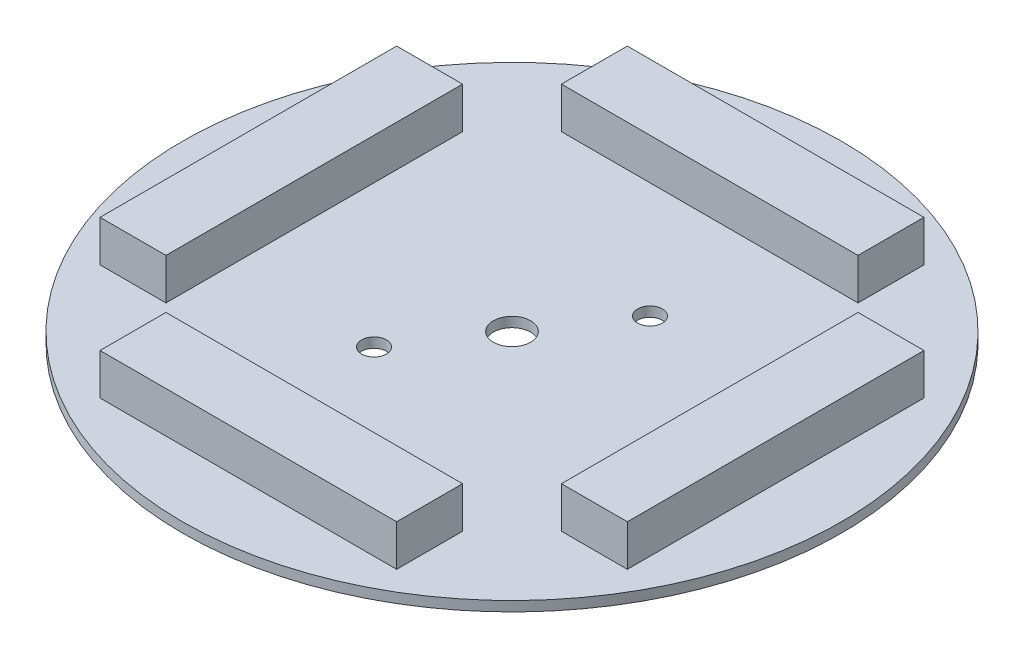
ISO-10303-21;
HEADER;
FILE_DESCRIPTION(('STEP AP214'),'2;1');
FILE_NAME('part.step','',(''),(''),'','','');
FILE_SCHEMA(('AUTOMOTIVE_DESIGN { 1 0 10303 214 1 1 1 1 }'));
ENDSEC;
DATA;
#1=APPLICATION_CONTEXT('core data for automotive mechanical design processes');
#2=APPLICATION_PROTOCOL_DEFINITION('international standard','automotive_design',2000,#1);
#3=PRODUCT_CONTEXT('',#1,'mechanical');
#4=PRODUCT('Part','Part','',(#3));
#5=PRODUCT_RELATED_PRODUCT_CATEGORY('part','',(#4));
#6=PRODUCT_DEFINITION_FORMATION('','',#4);
#7=PRODUCT_DEFINITION_CONTEXT('part definition',#1,'design');
#8=PRODUCT_DEFINITION('design','',#6,#7);
#9=PRODUCT_DEFINITION_SHAPE('','',#8);
#10=(LENGTH_UNIT() NAMED_UNIT(*) SI_UNIT(.MILLI.,.METRE.));
#11=(NAMED_UNIT(*) PLANE_ANGLE_UNIT() SI_UNIT($,.RADIAN.));
#12=(NAMED_UNIT(*) SI_UNIT($,.STERADIAN.) SOLID_ANGLE_UNIT());
#13=UNCERTAINTY_MEASURE_WITH_UNIT(LENGTH_MEASURE(1.E-05),#10,'distance_accuracy_value','');
#14=(GEOMETRIC_REPRESENTATION_CONTEXT(3) GLOBAL_UNCERTAINTY_ASSIGNED_CONTEXT((#13)) GLOBAL_UNIT_ASSIGNED_CONTEXT((#10,
#11,#12)) REPRESENTATION_CONTEXT('',''));
#15=CARTESIAN_POINT('',(0.,0.,0.));
#16=DIRECTION('',(0.,0.,1.));
#17=DIRECTION('',(1.,0.,0.));
#18=AXIS2_PLACEMENT_3D('',#15,#16,#17);
#19=CARTESIAN_POINT('',(0.,0.6,0.));
#20=DIRECTION('',(0.,1.,0.));
#21=DIRECTION('',(0.,0.,1.));
#22=AXIS2_PLACEMENT_3D('',#19,#20,#21);
#23=PLANE('',#22);
#24=CARTESIAN_POINT('',(0.,0.6,0.));
#25=DIRECTION('',(0.,1.,0.));
#26=DIRECTION('',(0.,0.,1.));
#27=AXIS2_PLACEMENT_3D('',#24,#25,#26);
#28=CIRCLE('',#27,1.1303);
#29=CARTESIAN_POINT('',(0.,0.6,1.1303));
#30=VERTEX_POINT('',#29);
#31=EDGE_CURVE('E299',#30,#30,#28,.T.);
#32=ORIENTED_EDGE('',*,*,#31,.F.);
#33=EDGE_LOOP('',(#32));
#34=FACE_BOUND('',#33,.T.);
#35=CARTESIAN_POINT('',(0.,0.6,0.));
#36=DIRECTION('',(0.,1.,0.));
#37=DIRECTION('',(0.,0.,1.));
#38=AXIS2_PLACEMENT_3D('',#35,#36,#37);
#39=CIRCLE('',#38,20.);
#40=CARTESIAN_POINT('',(0.,0.6,20.));
#41=VERTEX_POINT('',#40);
#42=EDGE_CURVE('E12',#41,#41,#39,.T.);
#43=ORIENTED_EDGE('',*,*,#42,.T.);
#44=EDGE_LOOP('',(#43));
#45=FACE_BOUND('',#44,.T.);
#46=CARTESIAN_POINT('',(-3.37254258421209,0.6,5.));
#47=DIRECTION('',(0.,1.,0.));
#48=DIRECTION('',(0.,0.,1.));
#49=AXIS2_PLACEMENT_3D('',#46,#47,#48);
#50=CIRCLE('',#49,0.75);
#51=CARTESIAN_POINT('',(-3.37254258421209,0.6,5.75));
#52=VERTEX_POINT('',#51);
#53=EDGE_CURVE('E305',#52,#52,#50,.T.);
#54=ORIENTED_EDGE('',*,*,#53,.F.);
#55=EDGE_LOOP('',(#54));
#56=FACE_BOUND('',#55,.T.);
#57=CARTESIAN_POINT('',(3.37254258421208,0.6,-5.));
#58=DIRECTION('',(0.,1.,0.));
#59=DIRECTION('',(0.,0.,1.));
#60=AXIS2_PLACEMENT_3D('',#57,#58,#59);
#61=CIRCLE('',#60,0.75);
#62=CARTESIAN_POINT('',(3.37254258421208,0.6,-4.25));
#63=VERTEX_POINT('',#62);
#64=EDGE_CURVE('E293',#63,#63,#61,.T.);
#65=ORIENTED_EDGE('',*,*,#64,.F.);
#66=EDGE_LOOP('',(#65));
#67=FACE_BOUND('',#66,.T.);
#68=DIRECTION('',(1.,0.,0.));
#69=VECTOR('',#68,1.);
#70=CARTESIAN_POINT('',(-9.,0.6,-12.));
#71=LINE('',#70,#69);
#72=CARTESIAN_POINT('',(-9.,0.6,-12.));
#73=VERTEX_POINT('',#72);
#74=CARTESIAN_POINT('',(9.,0.6,-12.));
#75=VERTEX_POINT('',#74);
#76=EDGE_CURVE('E275',#73,#75,#71,.T.);
#77=ORIENTED_EDGE('',*,*,#76,.F.);
#78=DIRECTION('',(0.,0.,1.));
#79=VECTOR('',#78,1.);
#80=CARTESIAN_POINT('',(-9.,0.6,-16.));
#81=LINE('',#80,#79);
#82=CARTESIAN_POINT('',(-9.,0.6,-16.));
#83=VERTEX_POINT('',#82);
#84=EDGE_CURVE('E259',#83,#73,#81,.T.);
#85=ORIENTED_EDGE('',*,*,#84,.F.);
#86=DIRECTION('',(1.,0.,0.));
#87=VECTOR('',#86,1.);
#88=CARTESIAN_POINT('',(-9.,0.6,-16.));
#89=LINE('',#88,#87);
#90=CARTESIAN_POINT('',(9.,0.6,-16.));
#91=VERTEX_POINT('',#90);
#92=EDGE_CURVE('E264',#83,#91,#89,.T.);
#93=ORIENTED_EDGE('',*,*,#92,.T.);
#94=DIRECTION('',(0.,0.,1.));
#95=VECTOR('',#94,1.);
#96=CARTESIAN_POINT('',(9.,0.6,-16.));
#97=LINE('',#96,#95);
#98=EDGE_CURVE('E278',#91,#75,#97,.T.);
#99=ORIENTED_EDGE('',*,*,#98,.T.);
#100=EDGE_LOOP('',(#77,#85,#93,#99));
#101=FACE_BOUND('',#100,.T.);
#102=DIRECTION('',(0.,0.,-1.));
#103=VECTOR('',#102,1.);
#104=CARTESIAN_POINT('',(-12.,0.6,9.00000000000004));
#105=LINE('',#104,#103);
#106=CARTESIAN_POINT('',(-12.,0.6,9.00000000000004));
#107=VERTEX_POINT('',#106);
#108=CARTESIAN_POINT('',(-12.,0.6,-8.99999999999996));
#109=VERTEX_POINT('',#108);
#110=EDGE_CURVE('E242',#107,#109,#105,.T.);
#111=ORIENTED_EDGE('',*,*,#110,.F.);
#112=DIRECTION('',(1.,0.,0.));
#113=VECTOR('',#112,1.);
#114=CARTESIAN_POINT('',(-16.,0.6,9.00000000000006));
#115=LINE('',#114,#113);
#116=CARTESIAN_POINT('',(-16.,0.6,9.00000000000006));
#117=VERTEX_POINT('',#116);
#118=EDGE_CURVE('E226',#117,#107,#115,.T.);
#119=ORIENTED_EDGE('',*,*,#118,.F.);
#120=DIRECTION('',(0.,0.,-1.));
#121=VECTOR('',#120,1.);
#122=CARTESIAN_POINT('',(-16.,0.6,9.00000000000006));
#123=LINE('',#122,#121);
#124=CARTESIAN_POINT('',(-16.,0.6,-8.99999999999994));
#125=VERTEX_POINT('',#124);
#126=EDGE_CURVE('E231',#117,#125,#123,.T.);
#127=ORIENTED_EDGE('',*,*,#126,.T.);
#128=DIRECTION('',(1.,0.,0.));
#129=VECTOR('',#128,1.);
#130=CARTESIAN_POINT('',(-16.,0.6,-8.99999999999994));
#131=LINE('',#130,#129);
#132=EDGE_CURVE('E245',#125,#109,#131,.T.);
#133=ORIENTED_EDGE('',*,*,#132,.T.);
#134=EDGE_LOOP('',(#111,#119,#127,#133));
#135=FACE_BOUND('',#134,.T.);
#136=DIRECTION('',(-1.,0.,0.));
#137=VECTOR('',#136,1.);
#138=CARTESIAN_POINT('',(9.,0.6,12.));
#139=LINE('',#138,#137);
#140=CARTESIAN_POINT('',(9.,0.6,12.));
#141=VERTEX_POINT('',#140);
#142=CARTESIAN_POINT('',(-9.,0.6,12.));
#143=VERTEX_POINT('',#142);
#144=EDGE_CURVE('E191',#141,#143,#139,.T.);
#145=ORIENTED_EDGE('',*,*,#144,.F.);
#146=DIRECTION('',(0.,0.,-1.));
#147=VECTOR('',#146,1.);
#148=CARTESIAN_POINT('',(9.,0.6,16.));
#149=LINE('',#148,#147);
#150=CARTESIAN_POINT('',(9.,0.6,16.));
#151=VERTEX_POINT('',#150);
#152=EDGE_CURVE('E188',#151,#141,#149,.T.);
#153=ORIENTED_EDGE('',*,*,#152,.F.);
#154=DIRECTION('',(-1.,0.,0.));
#155=VECTOR('',#154,1.);
#156=CARTESIAN_POINT('',(9.,0.6,16.));
#157=LINE('',#156,#155);
#158=CARTESIAN_POINT('',(-9.,0.6,16.));
#159=VERTEX_POINT('',#158);
#160=EDGE_CURVE('E201',#151,#159,#157,.T.);
#161=ORIENTED_EDGE('',*,*,#160,.T.);
#162=DIRECTION('',(0.,0.,-1.));
#163=VECTOR('',#162,1.);
#164=CARTESIAN_POINT('',(-9.,0.6,16.));
#165=LINE('',#164,#163);
#166=EDGE_CURVE('E212',#159,#143,#165,.T.);
#167=ORIENTED_EDGE('',*,*,#166,.T.);
#168=EDGE_LOOP('',(#145,#153,#161,#167));
#169=FACE_BOUND('',#168,.T.);
#170=DIRECTION('',(0.,0.,1.));
#171=VECTOR('',#170,1.);
#172=CARTESIAN_POINT('',(11.9999999999999,0.6,-9.00000000000012));
#173=LINE('',#172,#171);
#174=CARTESIAN_POINT('',(11.9999999999999,0.6,-9.00000000000012));
#175=VERTEX_POINT('',#174);
#176=CARTESIAN_POINT('',(12.0000000000001,0.6,8.99999999999988));
#177=VERTEX_POINT('',#176);
#178=EDGE_CURVE('E68',#175,#177,#173,.T.);
#179=ORIENTED_EDGE('',*,*,#178,.F.);
#180=DIRECTION('',(-1.,0.,0.));
#181=VECTOR('',#180,1.);
#182=CARTESIAN_POINT('',(15.9999999999999,0.6,-9.00000000000017));
#183=LINE('',#182,#181);
#184=CARTESIAN_POINT('',(15.9999999999999,0.6,-9.00000000000017));
#185=VERTEX_POINT('',#184);
#186=EDGE_CURVE('E187',#185,#175,#183,.T.);
#187=ORIENTED_EDGE('',*,*,#186,.F.);
#188=DIRECTION('',(0.,0.,1.));
#189=VECTOR('',#188,1.);
#190=CARTESIAN_POINT('',(15.9999999999999,0.6,-9.00000000000017));
#191=LINE('',#190,#189);
#192=CARTESIAN_POINT('',(16.0000000000001,0.6,8.99999999999983));
#193=VERTEX_POINT('',#192);
#194=EDGE_CURVE('E184',#185,#193,#191,.T.);
#195=ORIENTED_EDGE('',*,*,#194,.T.);
#196=DIRECTION('',(-1.,0.,0.));
#197=VECTOR('',#196,1.);
#198=CARTESIAN_POINT('',(16.0000000000001,0.6,8.99999999999983));
#199=LINE('',#198,#197);
#200=EDGE_CURVE('E73',#193,#177,#199,.T.);
#201=ORIENTED_EDGE('',*,*,#200,.T.);
#202=EDGE_LOOP('',(#179,#187,#195,#201));
#203=FACE_BOUND('',#202,.T.);
#204=ADVANCED_FACE('F53',(#34,#45,#56,#67,#101,#135,#169,#203),#23,.T.);
#205=CARTESIAN_POINT('',(0.,0.,0.));
#206=DIRECTION('',(0.,1.,0.));
#207=DIRECTION('',(0.,0.,1.));
#208=AXIS2_PLACEMENT_3D('',#205,#206,#207);
#209=PLANE('',#208);
#210=CARTESIAN_POINT('',(0.,0.,0.));
#211=DIRECTION('',(0.,1.,0.));
#212=DIRECTION('',(0.,0.,1.));
#213=AXIS2_PLACEMENT_3D('',#210,#211,#212);
#214=CIRCLE('',#213,20.);
#215=CARTESIAN_POINT('',(0.,0.,20.));
#216=VERTEX_POINT('',#215);
#217=EDGE_CURVE('E57',#216,#216,#214,.T.);
#218=ORIENTED_EDGE('',*,*,#217,.F.);
#219=EDGE_LOOP('',(#218));
#220=FACE_BOUND('',#219,.T.);
#221=CARTESIAN_POINT('',(-3.37254258421209,0.,5.));
#222=DIRECTION('',(0.,1.,0.));
#223=DIRECTION('',(0.,0.,1.));
#224=AXIS2_PLACEMENT_3D('',#221,#222,#223);
#225=CIRCLE('',#224,0.75);
#226=CARTESIAN_POINT('',(-3.37254258421209,0.,5.75));
#227=VERTEX_POINT('',#226);
#228=EDGE_CURVE('E302',#227,#227,#225,.T.);
#229=ORIENTED_EDGE('',*,*,#228,.T.);
#230=EDGE_LOOP('',(#229));
#231=FACE_BOUND('',#230,.T.);
#232=CARTESIAN_POINT('',(0.,0.,0.));
#233=DIRECTION('',(0.,1.,0.));
#234=DIRECTION('',(0.,0.,1.));
#235=AXIS2_PLACEMENT_3D('',#232,#233,#234);
#236=CIRCLE('',#235,1.1303);
#237=CARTESIAN_POINT('',(0.,0.,1.1303));
#238=VERTEX_POINT('',#237);
#239=EDGE_CURVE('E296',#238,#238,#236,.T.);
#240=ORIENTED_EDGE('',*,*,#239,.T.);
#241=EDGE_LOOP('',(#240));
#242=FACE_BOUND('',#241,.T.);
#243=CARTESIAN_POINT('',(3.37254258421208,0.,-5.));
#244=DIRECTION('',(0.,1.,0.));
#245=DIRECTION('',(0.,0.,1.));
#246=AXIS2_PLACEMENT_3D('',#243,#244,#245);
#247=CIRCLE('',#246,0.75);
#248=CARTESIAN_POINT('',(3.37254258421208,0.,-4.25));
#249=VERTEX_POINT('',#248);
#250=EDGE_CURVE('E292',#249,#249,#247,.T.);
#251=ORIENTED_EDGE('',*,*,#250,.T.);
#252=EDGE_LOOP('',(#251));
#253=FACE_BOUND('',#252,.T.);
#254=ADVANCED_FACE('F311',(#220,#231,#242,#253),#209,.F.);
#255=CARTESIAN_POINT('',(0.,0.6,0.));
#256=DIRECTION('',(0.,-1.,0.));
#257=DIRECTION('',(0.,0.,-1.));
#258=AXIS2_PLACEMENT_3D('',#255,#256,#257);
#259=CYLINDRICAL_SURFACE('',#258,20.);
#260=ORIENTED_EDGE('',*,*,#42,.F.);
#261=EDGE_LOOP('',(#260));
#262=FACE_BOUND('',#261,.T.);
#263=ORIENTED_EDGE('',*,*,#217,.T.);
#264=EDGE_LOOP('',(#263));
#265=FACE_BOUND('',#264,.T.);
#266=ADVANCED_FACE('F55',(#262,#265),#259,.T.);
#267=CARTESIAN_POINT('',(-3.37254258421209,0.6,5.));
#268=DIRECTION('',(0.,-1.,0.));
#269=DIRECTION('',(0.,0.,-1.));
#270=AXIS2_PLACEMENT_3D('',#267,#268,#269);
#271=CYLINDRICAL_SURFACE('',#270,0.75);
#272=ORIENTED_EDGE('',*,*,#53,.T.);
#273=EDGE_LOOP('',(#272));
#274=FACE_BOUND('',#273,.T.);
#275=ORIENTED_EDGE('',*,*,#228,.F.);
#276=EDGE_LOOP('',(#275));
#277=FACE_BOUND('',#276,.T.);
#278=ADVANCED_FACE('F314',(#274,#277),#271,.F.);
#279=CARTESIAN_POINT('',(0.,0.6,0.));
#280=DIRECTION('',(0.,-1.,0.));
#281=DIRECTION('',(0.,0.,-1.));
#282=AXIS2_PLACEMENT_3D('',#279,#280,#281);
#283=CYLINDRICAL_SURFACE('',#282,1.1303);
#284=ORIENTED_EDGE('',*,*,#31,.T.);
#285=EDGE_LOOP('',(#284));
#286=FACE_BOUND('',#285,.T.);
#287=ORIENTED_EDGE('',*,*,#239,.F.);
#288=EDGE_LOOP('',(#287));
#289=FACE_BOUND('',#288,.T.);
#290=ADVANCED_FACE('F316',(#286,#289),#283,.F.);
#291=CARTESIAN_POINT('',(3.37254258421208,0.6,-5.));
#292=DIRECTION('',(0.,-1.,0.));
#293=DIRECTION('',(0.,0.,-1.));
#294=AXIS2_PLACEMENT_3D('',#291,#292,#293);
#295=CYLINDRICAL_SURFACE('',#294,0.75);
#296=ORIENTED_EDGE('',*,*,#64,.T.);
#297=EDGE_LOOP('',(#296));
#298=FACE_BOUND('',#297,.T.);
#299=ORIENTED_EDGE('',*,*,#250,.F.);
#300=EDGE_LOOP('',(#299));
#301=FACE_BOUND('',#300,.T.);
#302=ADVANCED_FACE('F323',(#298,#301),#295,.F.);
#303=CARTESIAN_POINT('',(-9.,3.1,-16.));
#304=DIRECTION('',(1.,0.,0.));
#305=DIRECTION('',(0.,0.,-1.));
#306=AXIS2_PLACEMENT_3D('',#303,#304,#305);
#307=PLANE('',#306);
#308=ORIENTED_EDGE('',*,*,#84,.T.);
#309=DIRECTION('',(0.,-1.,0.));
#310=VECTOR('',#309,1.);
#311=CARTESIAN_POINT('',(-9.,3.1,-12.));
#312=LINE('',#311,#310);
#313=CARTESIAN_POINT('',(-9.,3.1,-12.));
#314=VERTEX_POINT('',#313);
#315=EDGE_CURVE('E289',#314,#73,#312,.T.);
#316=ORIENTED_EDGE('',*,*,#315,.F.);
#317=DIRECTION('',(0.,0.,1.));
#318=VECTOR('',#317,1.);
#319=CARTESIAN_POINT('',(-9.,3.1,-16.));
#320=LINE('',#319,#318);
#321=CARTESIAN_POINT('',(-9.,3.1,-16.));
#322=VERTEX_POINT('',#321);
#323=EDGE_CURVE('E260',#322,#314,#320,.T.);
#324=ORIENTED_EDGE('',*,*,#323,.F.);
#325=DIRECTION('',(0.,-1.,0.));
#326=VECTOR('',#325,1.);
#327=CARTESIAN_POINT('',(-9.,3.1,-16.));
#328=LINE('',#327,#326);
#329=EDGE_CURVE('E272',#322,#83,#328,.T.);
#330=ORIENTED_EDGE('',*,*,#329,.T.);
#331=EDGE_LOOP('',(#308,#316,#324,#330));
#332=FACE_BOUND('',#331,.T.);
#333=ADVANCED_FACE('F412',(#332),#307,.F.);
#334=CARTESIAN_POINT('',(-9.,3.1,-12.));
#335=DIRECTION('',(0.,0.,-1.));
#336=DIRECTION('',(-1.,0.,0.));
#337=AXIS2_PLACEMENT_3D('',#334,#335,#336);
#338=PLANE('',#337);
#339=ORIENTED_EDGE('',*,*,#76,.T.);
#340=DIRECTION('',(0.,-1.,0.));
#341=VECTOR('',#340,1.);
#342=CARTESIAN_POINT('',(9.,3.1,-12.));
#343=LINE('',#342,#341);
#344=CARTESIAN_POINT('',(9.,3.1,-12.));
#345=VERTEX_POINT('',#344);
#346=EDGE_CURVE('E286',#345,#75,#343,.T.);
#347=ORIENTED_EDGE('',*,*,#346,.F.);
#348=DIRECTION('',(1.,0.,0.));
#349=VECTOR('',#348,1.);
#350=CARTESIAN_POINT('',(-9.,3.1,-12.));
#351=LINE('',#350,#349);
#352=EDGE_CURVE('E263',#314,#345,#351,.T.);
#353=ORIENTED_EDGE('',*,*,#352,.F.);
#354=ORIENTED_EDGE('',*,*,#315,.T.);
#355=EDGE_LOOP('',(#339,#347,#353,#354));
#356=FACE_BOUND('',#355,.T.);
#357=ADVANCED_FACE('F408',(#356),#338,.F.);
#358=CARTESIAN_POINT('',(9.,3.1,-16.));
#359=DIRECTION('',(1.,0.,0.));
#360=DIRECTION('',(0.,0.,-1.));
#361=AXIS2_PLACEMENT_3D('',#358,#359,#360);
#362=PLANE('',#361);
#363=ORIENTED_EDGE('',*,*,#98,.F.);
#364=DIRECTION('',(0.,-1.,0.));
#365=VECTOR('',#364,1.);
#366=CARTESIAN_POINT('',(9.,3.1,-16.));
#367=LINE('',#366,#365);
#368=CARTESIAN_POINT('',(9.,3.1,-16.));
#369=VERTEX_POINT('',#368);
#370=EDGE_CURVE('E283',#369,#91,#367,.T.);
#371=ORIENTED_EDGE('',*,*,#370,.F.);
#372=DIRECTION('',(0.,0.,1.));
#373=VECTOR('',#372,1.);
#374=CARTESIAN_POINT('',(9.,3.1,-16.));
#375=LINE('',#374,#373);
#376=EDGE_CURVE('E266',#369,#345,#375,.T.);
#377=ORIENTED_EDGE('',*,*,#376,.T.);
#378=ORIENTED_EDGE('',*,*,#346,.T.);
#379=EDGE_LOOP('',(#363,#371,#377,#378));
#380=FACE_BOUND('',#379,.T.);
#381=ADVANCED_FACE('F404',(#380),#362,.T.);
#382=CARTESIAN_POINT('',(-9.,3.1,-16.));
#383=DIRECTION('',(0.,0.,-1.));
#384=DIRECTION('',(-1.,0.,0.));
#385=AXIS2_PLACEMENT_3D('',#382,#383,#384);
#386=PLANE('',#385);
#387=ORIENTED_EDGE('',*,*,#92,.F.);
#388=ORIENTED_EDGE('',*,*,#329,.F.);
#389=DIRECTION('',(1.,0.,0.));
#390=VECTOR('',#389,1.);
#391=CARTESIAN_POINT('',(-9.,3.1,-16.));
#392=LINE('',#391,#390);
#393=EDGE_CURVE('E269',#322,#369,#392,.T.);
#394=ORIENTED_EDGE('',*,*,#393,.T.);
#395=ORIENTED_EDGE('',*,*,#370,.T.);
#396=EDGE_LOOP('',(#387,#388,#394,#395));
#397=FACE_BOUND('',#396,.T.);
#398=ADVANCED_FACE('F400',(#397),#386,.T.);
#399=CARTESIAN_POINT('',(0.,3.1,0.));
#400=DIRECTION('',(0.,1.,0.));
#401=DIRECTION('',(0.,0.,1.));
#402=AXIS2_PLACEMENT_3D('',#399,#400,#401);
#403=PLANE('',#402);
#404=ORIENTED_EDGE('',*,*,#323,.T.);
#405=ORIENTED_EDGE('',*,*,#352,.T.);
#406=ORIENTED_EDGE('',*,*,#376,.F.);
#407=ORIENTED_EDGE('',*,*,#393,.F.);
#408=EDGE_LOOP('',(#404,#405,#406,#407));
#409=FACE_BOUND('',#408,.T.);
#410=ADVANCED_FACE('F396',(#409),#403,.T.);
#411=CARTESIAN_POINT('',(-16.,3.1,9.00000000000006));
#412=DIRECTION('',(0.,0.,-1.));
#413=DIRECTION('',(-1.,0.,0.));
#414=AXIS2_PLACEMENT_3D('',#411,#412,#413);
#415=PLANE('',#414);
#416=ORIENTED_EDGE('',*,*,#118,.T.);
#417=DIRECTION('',(0.,-1.,0.));
#418=VECTOR('',#417,1.);
#419=CARTESIAN_POINT('',(-12.,3.1,9.00000000000004));
#420=LINE('',#419,#418);
#421=CARTESIAN_POINT('',(-12.,3.1,9.00000000000004));
#422=VERTEX_POINT('',#421);
#423=EDGE_CURVE('E256',#422,#107,#420,.T.);
#424=ORIENTED_EDGE('',*,*,#423,.F.);
#425=DIRECTION('',(1.,0.,0.));
#426=VECTOR('',#425,1.);
#427=CARTESIAN_POINT('',(-16.,3.1,9.00000000000006));
#428=LINE('',#427,#426);
#429=CARTESIAN_POINT('',(-16.,3.1,9.00000000000006));
#430=VERTEX_POINT('',#429);
#431=EDGE_CURVE('E227',#430,#422,#428,.T.);
#432=ORIENTED_EDGE('',*,*,#431,.F.);
#433=DIRECTION('',(0.,-1.,0.));
#434=VECTOR('',#433,1.);
#435=CARTESIAN_POINT('',(-16.,3.1,9.00000000000006));
#436=LINE('',#435,#434);
#437=EDGE_CURVE('E239',#430,#117,#436,.T.);
#438=ORIENTED_EDGE('',*,*,#437,.T.);
#439=EDGE_LOOP('',(#416,#424,#432,#438));
#440=FACE_BOUND('',#439,.T.);
#441=ADVANCED_FACE('F392',(#440),#415,.F.);
#442=CARTESIAN_POINT('',(-12.,3.1,9.00000000000004));
#443=DIRECTION('',(-1.,0.,0.));
#444=DIRECTION('',(0.,0.,1.));
#445=AXIS2_PLACEMENT_3D('',#442,#443,#444);
#446=PLANE('',#445);
#447=ORIENTED_EDGE('',*,*,#110,.T.);
#448=DIRECTION('',(0.,-1.,0.));
#449=VECTOR('',#448,1.);
#450=CARTESIAN_POINT('',(-12.,3.1,-8.99999999999996));
#451=LINE('',#450,#449);
#452=CARTESIAN_POINT('',(-12.,3.1,-8.99999999999996));
#453=VERTEX_POINT('',#452);
#454=EDGE_CURVE('E253',#453,#109,#451,.T.);
#455=ORIENTED_EDGE('',*,*,#454,.F.);
#456=DIRECTION('',(0.,0.,-1.));
#457=VECTOR('',#456,1.);
#458=CARTESIAN_POINT('',(-12.,3.1,9.00000000000004));
#459=LINE('',#458,#457);
#460=EDGE_CURVE('E230',#422,#453,#459,.T.);
#461=ORIENTED_EDGE('',*,*,#460,.F.);
#462=ORIENTED_EDGE('',*,*,#423,.T.);
#463=EDGE_LOOP('',(#447,#455,#461,#462));
#464=FACE_BOUND('',#463,.T.);
#465=ADVANCED_FACE('F388',(#464),#446,.F.);
#466=CARTESIAN_POINT('',(-16.,3.1,-8.99999999999994));
#467=DIRECTION('',(0.,0.,-1.));
#468=DIRECTION('',(-1.,0.,0.));
#469=AXIS2_PLACEMENT_3D('',#466,#467,#468);
#470=PLANE('',#469);
#471=ORIENTED_EDGE('',*,*,#132,.F.);
#472=DIRECTION('',(0.,-1.,0.));
#473=VECTOR('',#472,1.);
#474=CARTESIAN_POINT('',(-16.,3.1,-8.99999999999994));
#475=LINE('',#474,#473);
#476=CARTESIAN_POINT('',(-16.,3.1,-8.99999999999994));
#477=VERTEX_POINT('',#476);
#478=EDGE_CURVE('E250',#477,#125,#475,.T.);
#479=ORIENTED_EDGE('',*,*,#478,.F.);
#480=DIRECTION('',(1.,0.,0.));
#481=VECTOR('',#480,1.);
#482=CARTESIAN_POINT('',(-16.,3.1,-8.99999999999994));
#483=LINE('',#482,#481);
#484=EDGE_CURVE('E233',#477,#453,#483,.T.);
#485=ORIENTED_EDGE('',*,*,#484,.T.);
#486=ORIENTED_EDGE('',*,*,#454,.T.);
#487=EDGE_LOOP('',(#471,#479,#485,#486));
#488=FACE_BOUND('',#487,.T.);
#489=ADVANCED_FACE('F384',(#488),#470,.T.);
#490=CARTESIAN_POINT('',(-16.,3.1,9.00000000000006));
#491=DIRECTION('',(-1.,0.,0.));
#492=DIRECTION('',(0.,0.,1.));
#493=AXIS2_PLACEMENT_3D('',#490,#491,#492);
#494=PLANE('',#493);
#495=ORIENTED_EDGE('',*,*,#126,.F.);
#496=ORIENTED_EDGE('',*,*,#437,.F.);
#497=DIRECTION('',(0.,0.,-1.));
#498=VECTOR('',#497,1.);
#499=CARTESIAN_POINT('',(-16.,3.1,9.00000000000006));
#500=LINE('',#499,#498);
#501=EDGE_CURVE('E236',#430,#477,#500,.T.);
#502=ORIENTED_EDGE('',*,*,#501,.T.);
#503=ORIENTED_EDGE('',*,*,#478,.T.);
#504=EDGE_LOOP('',(#495,#496,#502,#503));
#505=FACE_BOUND('',#504,.T.);
#506=ADVANCED_FACE('F380',(#505),#494,.T.);
#507=CARTESIAN_POINT('',(0.,3.1,0.));
#508=DIRECTION('',(0.,1.,0.));
#509=DIRECTION('',(1.,0.,0.));
#510=AXIS2_PLACEMENT_3D('',#507,#508,#509);
#511=PLANE('',#510);
#512=ORIENTED_EDGE('',*,*,#431,.T.);
#513=ORIENTED_EDGE('',*,*,#460,.T.);
#514=ORIENTED_EDGE('',*,*,#484,.F.);
#515=ORIENTED_EDGE('',*,*,#501,.F.);
#516=EDGE_LOOP('',(#512,#513,#514,#515));
#517=FACE_BOUND('',#516,.T.);
#518=ADVANCED_FACE('F377',(#517),#511,.T.);
#519=CARTESIAN_POINT('',(9.,3.1,16.));
#520=DIRECTION('',(-1.,0.,0.));
#521=DIRECTION('',(0.,0.,1.));
#522=AXIS2_PLACEMENT_3D('',#519,#520,#521);
#523=PLANE('',#522);
#524=ORIENTED_EDGE('',*,*,#152,.T.);
#525=DIRECTION('',(0.,-1.,0.));
#526=VECTOR('',#525,1.);
#527=CARTESIAN_POINT('',(9.,3.1,12.));
#528=LINE('',#527,#526);
#529=CARTESIAN_POINT('',(9.,3.1,12.));
#530=VERTEX_POINT('',#529);
#531=EDGE_CURVE('E223',#530,#141,#528,.T.);
#532=ORIENTED_EDGE('',*,*,#531,.F.);
#533=DIRECTION('',(0.,0.,-1.));
#534=VECTOR('',#533,1.);
#535=CARTESIAN_POINT('',(9.,3.1,16.));
#536=LINE('',#535,#534);
#537=CARTESIAN_POINT('',(9.,3.1,16.));
#538=VERTEX_POINT('',#537);
#539=EDGE_CURVE('E197',#538,#530,#536,.T.);
#540=ORIENTED_EDGE('',*,*,#539,.F.);
#541=DIRECTION('',(0.,-1.,0.));
#542=VECTOR('',#541,1.);
#543=CARTESIAN_POINT('',(9.,3.1,16.));
#544=LINE('',#543,#542);
#545=EDGE_CURVE('E208',#538,#151,#544,.T.);
#546=ORIENTED_EDGE('',*,*,#545,.T.);
#547=EDGE_LOOP('',(#524,#532,#540,#546));
#548=FACE_BOUND('',#547,.T.);
#549=ADVANCED_FACE('F351',(#548),#523,.F.);
#550=CARTESIAN_POINT('',(9.,3.1,12.));
#551=DIRECTION('',(0.,0.,1.));
#552=DIRECTION('',(1.,0.,0.));
#553=AXIS2_PLACEMENT_3D('',#550,#551,#552);
#554=PLANE('',#553);
#555=ORIENTED_EDGE('',*,*,#144,.T.);
#556=DIRECTION('',(0.,-1.,0.));
#557=VECTOR('',#556,1.);
#558=CARTESIAN_POINT('',(-9.,3.1,12.));
#559=LINE('',#558,#557);
#560=CARTESIAN_POINT('',(-9.,3.1,12.));
#561=VERTEX_POINT('',#560);
#562=EDGE_CURVE('E220',#561,#143,#559,.T.);
#563=ORIENTED_EDGE('',*,*,#562,.F.);
#564=DIRECTION('',(-1.,0.,0.));
#565=VECTOR('',#564,1.);
#566=CARTESIAN_POINT('',(9.,3.1,12.));
#567=LINE('',#566,#565);
#568=EDGE_CURVE('E200',#530,#561,#567,.T.);
#569=ORIENTED_EDGE('',*,*,#568,.F.);
#570=ORIENTED_EDGE('',*,*,#531,.T.);
#571=EDGE_LOOP('',(#555,#563,#569,#570));
#572=FACE_BOUND('',#571,.T.);
#573=ADVANCED_FACE('F348',(#572),#554,.F.);
#574=CARTESIAN_POINT('',(-9.,3.1,16.));
#575=DIRECTION('',(-1.,0.,0.));
#576=DIRECTION('',(0.,0.,1.));
#577=AXIS2_PLACEMENT_3D('',#574,#575,#576);
#578=PLANE('',#577);
#579=ORIENTED_EDGE('',*,*,#166,.F.);
#580=DIRECTION('',(0.,-1.,0.));
#581=VECTOR('',#580,1.);
#582=CARTESIAN_POINT('',(-9.,3.1,16.));
#583=LINE('',#582,#581);
#584=CARTESIAN_POINT('',(-9.,3.1,16.));
#585=VERTEX_POINT('',#584);
#586=EDGE_CURVE('E217',#585,#159,#583,.T.);
#587=ORIENTED_EDGE('',*,*,#586,.F.);
#588=DIRECTION('',(0.,0.,-1.));
#589=VECTOR('',#588,1.);
#590=CARTESIAN_POINT('',(-9.,3.1,16.));
#591=LINE('',#590,#589);
#592=EDGE_CURVE('E203',#585,#561,#591,.T.);
#593=ORIENTED_EDGE('',*,*,#592,.T.);
#594=ORIENTED_EDGE('',*,*,#562,.T.);
#595=EDGE_LOOP('',(#579,#587,#593,#594));
#596=FACE_BOUND('',#595,.T.);
#597=ADVANCED_FACE('F358',(#596),#578,.T.);
#598=CARTESIAN_POINT('',(9.,3.1,16.));
#599=DIRECTION('',(0.,0.,1.));
#600=DIRECTION('',(1.,0.,0.));
#601=AXIS2_PLACEMENT_3D('',#598,#599,#600);
#602=PLANE('',#601);
#603=ORIENTED_EDGE('',*,*,#160,.F.);
#604=ORIENTED_EDGE('',*,*,#545,.F.);
#605=DIRECTION('',(-1.,0.,0.));
#606=VECTOR('',#605,1.);
#607=CARTESIAN_POINT('',(9.,3.1,16.));
#608=LINE('',#607,#606);
#609=EDGE_CURVE('E206',#538,#585,#608,.T.);
#610=ORIENTED_EDGE('',*,*,#609,.T.);
#611=ORIENTED_EDGE('',*,*,#586,.T.);
#612=EDGE_LOOP('',(#603,#604,#610,#611));
#613=FACE_BOUND('',#612,.T.);
#614=ADVANCED_FACE('F355',(#613),#602,.T.);
#615=CARTESIAN_POINT('',(0.,3.1,0.));
#616=DIRECTION('',(0.,1.,0.));
#617=DIRECTION('',(0.,0.,-1.));
#618=AXIS2_PLACEMENT_3D('',#615,#616,#617);
#619=PLANE('',#618);
#620=ORIENTED_EDGE('',*,*,#539,.T.);
#621=ORIENTED_EDGE('',*,*,#568,.T.);
#622=ORIENTED_EDGE('',*,*,#592,.F.);
#623=ORIENTED_EDGE('',*,*,#609,.F.);
#624=EDGE_LOOP('',(#620,#621,#622,#623));
#625=FACE_BOUND('',#624,.T.);
#626=ADVANCED_FACE('F360',(#625),#619,.T.);
#627=CARTESIAN_POINT('',(15.9999999999999,3.1,-9.00000000000017));
#628=DIRECTION('',(0.,0.,1.));
#629=DIRECTION('',(1.,0.,0.));
#630=AXIS2_PLACEMENT_3D('',#627,#628,#629);
#631=PLANE('',#630);
#632=ORIENTED_EDGE('',*,*,#186,.T.);
#633=DIRECTION('',(0.,-1.,0.));
#634=VECTOR('',#633,1.);
#635=CARTESIAN_POINT('',(11.9999999999999,3.1,-9.00000000000012));
#636=LINE('',#635,#634);
#637=CARTESIAN_POINT('',(11.9999999999999,3.1,-9.00000000000012));
#638=VERTEX_POINT('',#637);
#639=EDGE_CURVE('E168',#638,#175,#636,.T.);
#640=ORIENTED_EDGE('',*,*,#639,.F.);
#641=DIRECTION('',(-1.,0.,0.));
#642=VECTOR('',#641,1.);
#643=CARTESIAN_POINT('',(15.9999999999999,3.1,-9.00000000000017));
#644=LINE('',#643,#642);
#645=CARTESIAN_POINT('',(15.9999999999999,3.1,-9.00000000000017));
#646=VERTEX_POINT('',#645);
#647=EDGE_CURVE('E175',#646,#638,#644,.T.);
#648=ORIENTED_EDGE('',*,*,#647,.F.);
#649=DIRECTION('',(0.,-1.,0.));
#650=VECTOR('',#649,1.);
#651=CARTESIAN_POINT('',(15.9999999999999,3.1,-9.00000000000017));
#652=LINE('',#651,#650);
#653=EDGE_CURVE('E549',#646,#185,#652,.T.);
#654=ORIENTED_EDGE('',*,*,#653,.T.);
#655=EDGE_LOOP('',(#632,#640,#648,#654));
#656=FACE_BOUND('',#655,.T.);
#657=ADVANCED_FACE('F186',(#656),#631,.F.);
#658=CARTESIAN_POINT('',(11.9999999999999,3.1,-9.00000000000012));
#659=DIRECTION('',(1.,0.,0.));
#660=DIRECTION('',(0.,0.,-1.));
#661=AXIS2_PLACEMENT_3D('',#658,#659,#660);
#662=PLANE('',#661);
#663=ORIENTED_EDGE('',*,*,#178,.T.);
#664=DIRECTION('',(0.,-1.,0.));
#665=VECTOR('',#664,1.);
#666=CARTESIAN_POINT('',(12.0000000000001,3.1,8.99999999999988));
#667=LINE('',#666,#665);
#668=CARTESIAN_POINT('',(12.0000000000001,3.1,8.99999999999988));
#669=VERTEX_POINT('',#668);
#670=EDGE_CURVE('E170',#669,#177,#667,.T.);
#671=ORIENTED_EDGE('',*,*,#670,.F.);
#672=DIRECTION('',(0.,0.,1.));
#673=VECTOR('',#672,1.);
#674=CARTESIAN_POINT('',(11.9999999999999,3.1,-9.00000000000012));
#675=LINE('',#674,#673);
#676=EDGE_CURVE('E164',#638,#669,#675,.T.);
#677=ORIENTED_EDGE('',*,*,#676,.F.);
#678=ORIENTED_EDGE('',*,*,#639,.T.);
#679=EDGE_LOOP('',(#663,#671,#677,#678));
#680=FACE_BOUND('',#679,.T.);
#681=ADVANCED_FACE('F166',(#680),#662,.F.);
#682=CARTESIAN_POINT('',(16.0000000000001,3.1,8.99999999999983));
#683=DIRECTION('',(0.,0.,1.));
#684=DIRECTION('',(1.,0.,0.));
#685=AXIS2_PLACEMENT_3D('',#682,#683,#684);
#686=PLANE('',#685);
#687=ORIENTED_EDGE('',*,*,#200,.F.);
#688=DIRECTION('',(0.,-1.,0.));
#689=VECTOR('',#688,1.);
#690=CARTESIAN_POINT('',(16.0000000000001,3.1,8.99999999999983));
#691=LINE('',#690,#689);
#692=CARTESIAN_POINT('',(16.0000000000001,3.1,8.99999999999983));
#693=VERTEX_POINT('',#692);
#694=EDGE_CURVE('E193',#693,#193,#691,.T.);
#695=ORIENTED_EDGE('',*,*,#694,.F.);
#696=DIRECTION('',(-1.,0.,0.));
#697=VECTOR('',#696,1.);
#698=CARTESIAN_POINT('',(16.0000000000001,3.1,8.99999999999983));
#699=LINE('',#698,#697);
#700=EDGE_CURVE('E174',#693,#669,#699,.T.);
#701=ORIENTED_EDGE('',*,*,#700,.T.);
#702=ORIENTED_EDGE('',*,*,#670,.T.);
#703=EDGE_LOOP('',(#687,#695,#701,#702));
#704=FACE_BOUND('',#703,.T.);
#705=ADVANCED_FACE('F510',(#704),#686,.T.);
#706=CARTESIAN_POINT('',(15.9999999999999,3.1,-9.00000000000017));
#707=DIRECTION('',(1.,0.,0.));
#708=DIRECTION('',(0.,0.,-1.));
#709=AXIS2_PLACEMENT_3D('',#706,#707,#708);
#710=PLANE('',#709);
#711=ORIENTED_EDGE('',*,*,#194,.F.);
#712=ORIENTED_EDGE('',*,*,#653,.F.);
#713=DIRECTION('',(0.,0.,1.));
#714=VECTOR('',#713,1.);
#715=CARTESIAN_POINT('',(15.9999999999999,3.1,-9.00000000000017));
#716=LINE('',#715,#714);
#717=EDGE_CURVE('E181',#646,#693,#716,.T.);
#718=ORIENTED_EDGE('',*,*,#717,.T.);
#719=ORIENTED_EDGE('',*,*,#694,.T.);
#720=EDGE_LOOP('',(#711,#712,#718,#719));
#721=FACE_BOUND('',#720,.T.);
#722=ADVANCED_FACE('F520',(#721),#710,.T.);
#723=CARTESIAN_POINT('',(0.,3.1,0.));
#724=DIRECTION('',(0.,1.,0.));
#725=DIRECTION('',(-1.,0.,0.));
#726=AXIS2_PLACEMENT_3D('',#723,#724,#725);
#727=PLANE('',#726);
#728=ORIENTED_EDGE('',*,*,#647,.T.);
#729=ORIENTED_EDGE('',*,*,#676,.T.);
#730=ORIENTED_EDGE('',*,*,#700,.F.);
#731=ORIENTED_EDGE('',*,*,#717,.F.);
#732=EDGE_LOOP('',(#728,#729,#730,#731));
#733=FACE_BOUND('',#732,.T.);
#734=ADVANCED_FACE('F179',(#733),#727,.T.);
#735=CLOSED_SHELL('',(#204,#254,#266,#278,#290,#302,#333,#357,#381,#398,#410,#441,#465,#489,
#506,#518,#549,#573,#597,#614,#626,#657,#681,#705,#722,#734));
#736=MANIFOLD_SOLID_BREP('B2',#735);
#737=ADVANCED_BREP_SHAPE_REPRESENTATION('',(#18,#736),#14);
#738=SHAPE_DEFINITION_REPRESENTATION(#9,#737);
ENDSEC;
END-ISO-10303-21;
